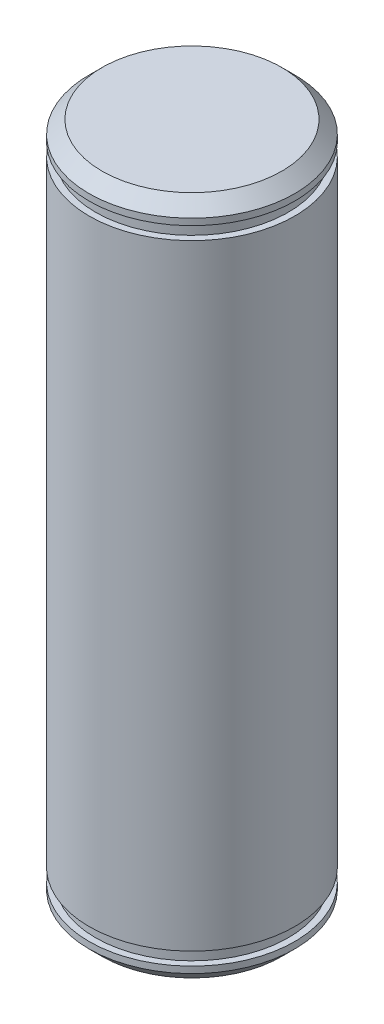
ISO-10303-21;
HEADER;
FILE_DESCRIPTION(('STEP AP214'),'2;1');
FILE_NAME('part.step','',(''),(''),'','','');
FILE_SCHEMA(('AUTOMOTIVE_DESIGN { 1 0 10303 214 1 1 1 1 }'));
ENDSEC;
DATA;
#1=APPLICATION_CONTEXT('core data for automotive mechanical design processes');
#2=APPLICATION_PROTOCOL_DEFINITION('international standard','automotive_design',2000,#1);
#3=PRODUCT_CONTEXT('',#1,'mechanical');
#4=PRODUCT('Part','Part','',(#3));
#5=PRODUCT_RELATED_PRODUCT_CATEGORY('part','',(#4));
#6=PRODUCT_DEFINITION_FORMATION('','',#4);
#7=PRODUCT_DEFINITION_CONTEXT('part definition',#1,'design');
#8=PRODUCT_DEFINITION('design','',#6,#7);
#9=PRODUCT_DEFINITION_SHAPE('','',#8);
#10=(LENGTH_UNIT() NAMED_UNIT(*) SI_UNIT(.MILLI.,.METRE.));
#11=(NAMED_UNIT(*) PLANE_ANGLE_UNIT() SI_UNIT($,.RADIAN.));
#12=(NAMED_UNIT(*) SI_UNIT($,.STERADIAN.) SOLID_ANGLE_UNIT());
#13=UNCERTAINTY_MEASURE_WITH_UNIT(LENGTH_MEASURE(1.E-05),#10,'distance_accuracy_value','');
#14=(GEOMETRIC_REPRESENTATION_CONTEXT(3) GLOBAL_UNCERTAINTY_ASSIGNED_CONTEXT((#13)) GLOBAL_UNIT_ASSIGNED_CONTEXT((#10,
#11,#12)) REPRESENTATION_CONTEXT('',''));
#15=CARTESIAN_POINT('',(0.,0.,0.));
#16=DIRECTION('',(0.,0.,1.));
#17=DIRECTION('',(1.,0.,0.));
#18=AXIS2_PLACEMENT_3D('',#15,#16,#17);
#19=CARTESIAN_POINT('',(0.,105.,0.));
#20=DIRECTION('',(0.,-1.,0.));
#21=DIRECTION('',(0.,0.,-1.));
#22=AXIS2_PLACEMENT_3D('',#19,#20,#21);
#23=CYLINDRICAL_SURFACE('',#22,15.875);
#24=CARTESIAN_POINT('',(0.,100.,0.));
#25=DIRECTION('',(0.,1.,0.));
#26=DIRECTION('',(0.,0.,1.));
#27=AXIS2_PLACEMENT_3D('',#24,#25,#26);
#28=CIRCLE('',#27,15.875);
#29=CARTESIAN_POINT('',(0.,100.,15.875));
#30=VERTEX_POINT('',#29);
#31=EDGE_CURVE('E79',#30,#30,#28,.T.);
#32=ORIENTED_EDGE('',*,*,#31,.F.);
#33=EDGE_LOOP('',(#32));
#34=FACE_BOUND('',#33,.T.);
#35=CARTESIAN_POINT('',(0.,5.,0.));
#36=DIRECTION('',(0.,1.,0.));
#37=DIRECTION('',(0.,0.,1.));
#38=AXIS2_PLACEMENT_3D('',#35,#36,#37);
#39=CIRCLE('',#38,15.875);
#40=CARTESIAN_POINT('',(0.,5.,15.875));
#41=VERTEX_POINT('',#40);
#42=EDGE_CURVE('E66',#41,#41,#39,.T.);
#43=ORIENTED_EDGE('',*,*,#42,.T.);
#44=EDGE_LOOP('',(#43));
#45=FACE_BOUND('',#44,.T.);
#46=ADVANCED_FACE('F41',(#34,#45),#23,.T.);
#47=CARTESIAN_POINT('',(0.,5.,0.));
#48=DIRECTION('',(0.,1.,0.));
#49=DIRECTION('',(0.,0.,1.));
#50=AXIS2_PLACEMENT_3D('',#47,#48,#49);
#51=PLANE('',#50);
#52=ORIENTED_EDGE('',*,*,#42,.F.);
#53=EDGE_LOOP('',(#52));
#54=FACE_BOUND('',#53,.T.);
#55=CARTESIAN_POINT('',(0.,5.,0.));
#56=DIRECTION('',(0.,1.,0.));
#57=DIRECTION('',(0.,0.,1.));
#58=AXIS2_PLACEMENT_3D('',#55,#56,#57);
#59=CIRCLE('',#58,14.875);
#60=CARTESIAN_POINT('',(0.,5.,14.875));
#61=VERTEX_POINT('',#60);
#62=EDGE_CURVE('E71',#61,#61,#59,.T.);
#63=ORIENTED_EDGE('',*,*,#62,.T.);
#64=EDGE_LOOP('',(#63));
#65=FACE_BOUND('',#64,.T.);
#66=ADVANCED_FACE('F112',(#54,#65),#51,.F.);
#67=CARTESIAN_POINT('',(0.,3.,0.));
#68=DIRECTION('',(0.,1.,0.));
#69=DIRECTION('',(0.,0.,1.));
#70=AXIS2_PLACEMENT_3D('',#67,#68,#69);
#71=PLANE('',#70);
#72=CARTESIAN_POINT('',(0.,3.,0.));
#73=DIRECTION('',(0.,1.,0.));
#74=DIRECTION('',(0.,0.,1.));
#75=AXIS2_PLACEMENT_3D('',#72,#73,#74);
#76=CIRCLE('',#75,15.875);
#77=CARTESIAN_POINT('',(0.,3.,15.875));
#78=VERTEX_POINT('',#77);
#79=EDGE_CURVE('E67',#78,#78,#76,.T.);
#80=ORIENTED_EDGE('',*,*,#79,.T.);
#81=EDGE_LOOP('',(#80));
#82=FACE_BOUND('',#81,.T.);
#83=CARTESIAN_POINT('',(0.,3.,0.));
#84=DIRECTION('',(0.,1.,0.));
#85=DIRECTION('',(0.,0.,1.));
#86=AXIS2_PLACEMENT_3D('',#83,#84,#85);
#87=CIRCLE('',#86,14.875);
#88=CARTESIAN_POINT('',(0.,3.,14.875));
#89=VERTEX_POINT('',#88);
#90=EDGE_CURVE('E75',#89,#89,#87,.T.);
#91=ORIENTED_EDGE('',*,*,#90,.F.);
#92=EDGE_LOOP('',(#91));
#93=FACE_BOUND('',#92,.T.);
#94=ADVANCED_FACE('F119',(#82,#93),#71,.T.);
#95=CARTESIAN_POINT('',(0.,5.,0.));
#96=DIRECTION('',(0.,-1.,0.));
#97=DIRECTION('',(0.,0.,-1.));
#98=AXIS2_PLACEMENT_3D('',#95,#96,#97);
#99=CYLINDRICAL_SURFACE('',#98,14.875);
#100=ORIENTED_EDGE('',*,*,#62,.F.);
#101=EDGE_LOOP('',(#100));
#102=FACE_BOUND('',#101,.T.);
#103=ORIENTED_EDGE('',*,*,#90,.T.);
#104=EDGE_LOOP('',(#103));
#105=FACE_BOUND('',#104,.T.);
#106=ADVANCED_FACE('F123',(#102,#105),#99,.T.);
#107=CARTESIAN_POINT('',(0.,0.,0.));
#108=DIRECTION('',(0.,1.,0.));
#109=DIRECTION('',(0.,0.,1.));
#110=AXIS2_PLACEMENT_3D('',#107,#108,#109);
#111=PLANE('',#110);
#112=CARTESIAN_POINT('',(0.,0.,0.));
#113=DIRECTION('',(0.,1.,0.));
#114=DIRECTION('',(0.,0.,1.));
#115=AXIS2_PLACEMENT_3D('',#112,#113,#114);
#116=CIRCLE('',#115,13.875);
#117=CARTESIAN_POINT('',(0.,0.,13.875));
#118=VERTEX_POINT('',#117);
#119=EDGE_CURVE('E50',#118,#118,#116,.F.);
#120=ORIENTED_EDGE('',*,*,#119,.T.);
#121=EDGE_LOOP('',(#120));
#122=FACE_BOUND('',#121,.T.);
#123=ADVANCED_FACE('F126',(#122),#111,.F.);
#124=CARTESIAN_POINT('',(0.,2.00000000000002,0.));
#125=DIRECTION('',(0.,1.,0.));
#126=DIRECTION('',(0.,0.,1.));
#127=AXIS2_PLACEMENT_3D('',#124,#125,#126);
#128=CONICAL_SURFACE('',#127,15.875,0.785398163397452);
#129=ORIENTED_EDGE('',*,*,#119,.F.);
#130=EDGE_LOOP('',(#129));
#131=FACE_BOUND('',#130,.T.);
#132=CARTESIAN_POINT('',(0.,2.00000000000002,0.));
#133=DIRECTION('',(0.,1.,0.));
#134=DIRECTION('',(0.,0.,1.));
#135=AXIS2_PLACEMENT_3D('',#132,#133,#134);
#136=CIRCLE('',#135,15.875);
#137=CARTESIAN_POINT('',(0.,2.00000000000002,15.875));
#138=VERTEX_POINT('',#137);
#139=EDGE_CURVE('E55',#138,#138,#136,.T.);
#140=ORIENTED_EDGE('',*,*,#139,.F.);
#141=EDGE_LOOP('',(#140));
#142=FACE_BOUND('',#141,.T.);
#143=ADVANCED_FACE('F140',(#131,#142),#128,.T.);
#144=ORIENTED_EDGE('',*,*,#139,.T.);
#145=EDGE_LOOP('',(#144));
#146=FACE_BOUND('',#145,.T.);
#147=ORIENTED_EDGE('',*,*,#79,.F.);
#148=EDGE_LOOP('',(#147));
#149=FACE_BOUND('',#148,.T.);
#150=ADVANCED_FACE('F106',(#146,#149),#23,.T.);
#151=CARTESIAN_POINT('',(0.,100.,0.));
#152=DIRECTION('',(0.,-1.,0.));
#153=DIRECTION('',(0.,0.,1.));
#154=AXIS2_PLACEMENT_3D('',#151,#152,#153);
#155=PLANE('',#154);
#156=CARTESIAN_POINT('',(0.,100.,0.));
#157=DIRECTION('',(0.,1.,0.));
#158=DIRECTION('',(0.,0.,1.));
#159=AXIS2_PLACEMENT_3D('',#156,#157,#158);
#160=CIRCLE('',#159,14.875);
#161=CARTESIAN_POINT('',(0.,100.,14.875));
#162=VERTEX_POINT('',#161);
#163=EDGE_CURVE('E87',#162,#162,#160,.T.);
#164=ORIENTED_EDGE('',*,*,#163,.F.);
#165=EDGE_LOOP('',(#164));
#166=FACE_BOUND('',#165,.T.);
#167=ORIENTED_EDGE('',*,*,#31,.T.);
#168=EDGE_LOOP('',(#167));
#169=FACE_BOUND('',#168,.T.);
#170=ADVANCED_FACE('F102',(#166,#169),#155,.F.);
#171=CARTESIAN_POINT('',(0.,102.,0.));
#172=DIRECTION('',(0.,-1.,0.));
#173=DIRECTION('',(0.,0.,1.));
#174=AXIS2_PLACEMENT_3D('',#171,#172,#173);
#175=PLANE('',#174);
#176=CARTESIAN_POINT('',(0.,102.,0.));
#177=DIRECTION('',(0.,1.,0.));
#178=DIRECTION('',(0.,0.,1.));
#179=AXIS2_PLACEMENT_3D('',#176,#177,#178);
#180=CIRCLE('',#179,14.875);
#181=CARTESIAN_POINT('',(0.,102.,14.875));
#182=VERTEX_POINT('',#181);
#183=EDGE_CURVE('E91',#182,#182,#180,.T.);
#184=ORIENTED_EDGE('',*,*,#183,.T.);
#185=EDGE_LOOP('',(#184));
#186=FACE_BOUND('',#185,.T.);
#187=CARTESIAN_POINT('',(0.,102.,0.));
#188=DIRECTION('',(0.,1.,0.));
#189=DIRECTION('',(0.,0.,1.));
#190=AXIS2_PLACEMENT_3D('',#187,#188,#189);
#191=CIRCLE('',#190,15.875);
#192=CARTESIAN_POINT('',(0.,102.,15.875));
#193=VERTEX_POINT('',#192);
#194=EDGE_CURVE('E83',#193,#193,#191,.T.);
#195=ORIENTED_EDGE('',*,*,#194,.F.);
#196=EDGE_LOOP('',(#195));
#197=FACE_BOUND('',#196,.T.);
#198=ADVANCED_FACE('F105',(#186,#197),#175,.T.);
#199=CARTESIAN_POINT('',(0.,100.,0.));
#200=DIRECTION('',(0.,1.,0.));
#201=DIRECTION('',(0.,0.,1.));
#202=AXIS2_PLACEMENT_3D('',#199,#200,#201);
#203=CYLINDRICAL_SURFACE('',#202,14.875);
#204=ORIENTED_EDGE('',*,*,#163,.T.);
#205=EDGE_LOOP('',(#204));
#206=FACE_BOUND('',#205,.T.);
#207=ORIENTED_EDGE('',*,*,#183,.F.);
#208=EDGE_LOOP('',(#207));
#209=FACE_BOUND('',#208,.T.);
#210=ADVANCED_FACE('F99',(#206,#209),#203,.T.);
#211=CARTESIAN_POINT('',(0.,105.,0.));
#212=DIRECTION('',(0.,1.,0.));
#213=DIRECTION('',(0.,0.,1.));
#214=AXIS2_PLACEMENT_3D('',#211,#212,#213);
#215=PLANE('',#214);
#216=CARTESIAN_POINT('',(0.,105.,0.));
#217=DIRECTION('',(0.,1.,0.));
#218=DIRECTION('',(0.,0.,1.));
#219=AXIS2_PLACEMENT_3D('',#216,#217,#218);
#220=CIRCLE('',#219,13.875);
#221=CARTESIAN_POINT('',(0.,105.,13.875));
#222=VERTEX_POINT('',#221);
#223=EDGE_CURVE('E10',#222,#222,#220,.T.);
#224=ORIENTED_EDGE('',*,*,#223,.T.);
#225=EDGE_LOOP('',(#224));
#226=FACE_BOUND('',#225,.T.);
#227=ADVANCED_FACE('F136',(#226),#215,.T.);
#228=CARTESIAN_POINT('',(0.,105.,0.));
#229=DIRECTION('',(0.,-1.,0.));
#230=DIRECTION('',(0.,0.,-1.));
#231=AXIS2_PLACEMENT_3D('',#228,#229,#230);
#232=CONICAL_SURFACE('',#231,13.875,0.785398163397445);
#233=CARTESIAN_POINT('',(0.,103.,0.));
#234=DIRECTION('',(0.,1.,0.));
#235=DIRECTION('',(0.,0.,1.));
#236=AXIS2_PLACEMENT_3D('',#233,#234,#235);
#237=CIRCLE('',#236,15.875);
#238=CARTESIAN_POINT('',(0.,103.,15.875));
#239=VERTEX_POINT('',#238);
#240=EDGE_CURVE('E60',#239,#239,#237,.F.);
#241=ORIENTED_EDGE('',*,*,#240,.F.);
#242=EDGE_LOOP('',(#241));
#243=FACE_BOUND('',#242,.T.);
#244=ORIENTED_EDGE('',*,*,#223,.F.);
#245=EDGE_LOOP('',(#244));
#246=FACE_BOUND('',#245,.T.);
#247=ADVANCED_FACE('F44',(#243,#246),#232,.T.);
#248=ORIENTED_EDGE('',*,*,#240,.T.);
#249=EDGE_LOOP('',(#248));
#250=FACE_BOUND('',#249,.T.);
#251=ORIENTED_EDGE('',*,*,#194,.T.);
#252=EDGE_LOOP('',(#251));
#253=FACE_BOUND('',#252,.T.);
#254=ADVANCED_FACE('F114',(#250,#253),#23,.T.);
#255=CLOSED_SHELL('',(#46,#66,#94,#106,#123,#143,#150,#170,#198,#210,#227,#247,#254));
#256=MANIFOLD_SOLID_BREP('B2',#255);
#257=ADVANCED_BREP_SHAPE_REPRESENTATION('',(#18,#256),#14);
#258=SHAPE_DEFINITION_REPRESENTATION(#9,#257);
ENDSEC;
END-ISO-10303-21;
